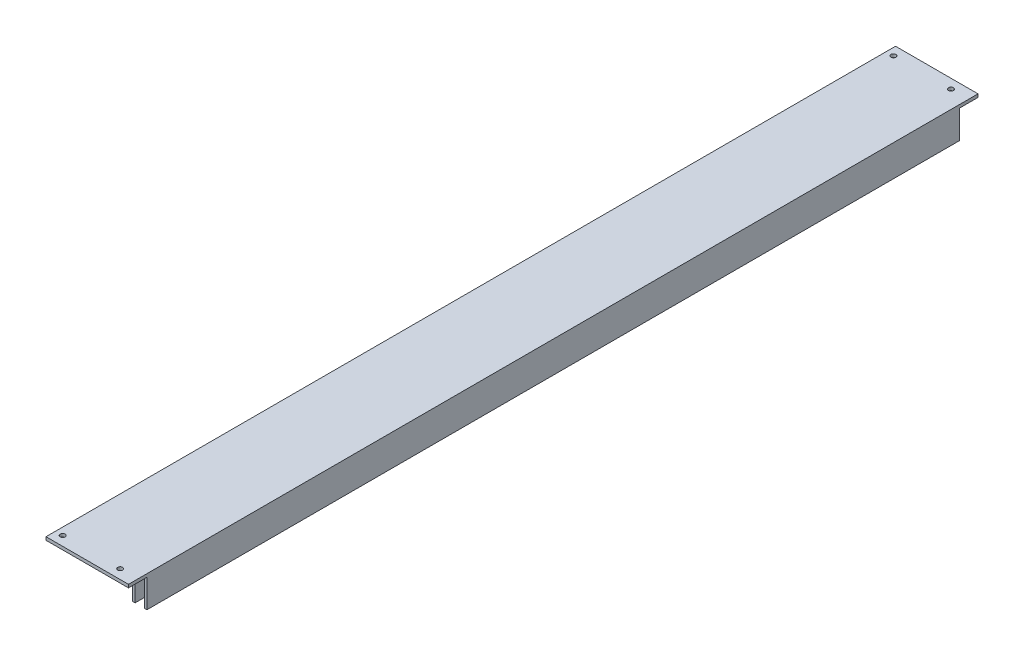
ISO-10303-21;
HEADER;
FILE_DESCRIPTION(('STEP AP214'),'2;1');
FILE_NAME('part.step','',(''),(''),'','','');
FILE_SCHEMA(('AUTOMOTIVE_DESIGN { 1 0 10303 214 1 1 1 1 }'));
ENDSEC;
DATA;
#1=APPLICATION_CONTEXT('core data for automotive mechanical design processes');
#2=APPLICATION_PROTOCOL_DEFINITION('international standard','automotive_design',2000,#1);
#3=PRODUCT_CONTEXT('',#1,'mechanical');
#4=PRODUCT('Part','Part','',(#3));
#5=PRODUCT_RELATED_PRODUCT_CATEGORY('part','',(#4));
#6=PRODUCT_DEFINITION_FORMATION('','',#4);
#7=PRODUCT_DEFINITION_CONTEXT('part definition',#1,'design');
#8=PRODUCT_DEFINITION('design','',#6,#7);
#9=PRODUCT_DEFINITION_SHAPE('','',#8);
#10=(LENGTH_UNIT() NAMED_UNIT(*) SI_UNIT(.MILLI.,.METRE.));
#11=(NAMED_UNIT(*) PLANE_ANGLE_UNIT() SI_UNIT($,.RADIAN.));
#12=(NAMED_UNIT(*) SI_UNIT($,.STERADIAN.) SOLID_ANGLE_UNIT());
#13=UNCERTAINTY_MEASURE_WITH_UNIT(LENGTH_MEASURE(1.E-05),#10,'distance_accuracy_value','');
#14=(GEOMETRIC_REPRESENTATION_CONTEXT(3) GLOBAL_UNCERTAINTY_ASSIGNED_CONTEXT((#13)) GLOBAL_UNIT_ASSIGNED_CONTEXT((#10,
#11,#12)) REPRESENTATION_CONTEXT('',''));
#15=CARTESIAN_POINT('',(0.,0.,0.));
#16=DIRECTION('',(0.,0.,1.));
#17=DIRECTION('',(1.,0.,0.));
#18=AXIS2_PLACEMENT_3D('',#15,#16,#17);
#19=CARTESIAN_POINT('',(-14.9787289884313,281.999999999999,-246.3325));
#20=DIRECTION('',(0.,0.,1.));
#21=DIRECTION('',(1.,0.,0.));
#22=AXIS2_PLACEMENT_3D('',#19,#20,#21);
#23=PLANE('',#22);
#24=DIRECTION('',(1.,0.,0.));
#25=VECTOR('',#24,1.);
#26=CARTESIAN_POINT('',(-22.1787289884313,264.930896236257,-246.3325));
#27=LINE('',#26,#25);
#28=CARTESIAN_POINT('',(-23.6787289884313,264.930896236257,-246.3325));
#29=VERTEX_POINT('',#28);
#30=CARTESIAN_POINT('',(-22.1787289884313,264.930896236257,-246.3325));
#31=VERTEX_POINT('',#30);
#32=EDGE_CURVE('E109',#29,#31,#27,.T.);
#33=ORIENTED_EDGE('',*,*,#32,.F.);
#34=DIRECTION('',(0.,1.,0.));
#35=VECTOR('',#34,1.);
#36=CARTESIAN_POINT('',(-23.6787289884313,264.930896236257,-246.3325));
#37=LINE('',#36,#35);
#38=CARTESIAN_POINT('',(-23.6787289884313,281.999999999999,-246.3325));
#39=VERTEX_POINT('',#38);
#40=EDGE_CURVE('E111',#39,#29,#37,.F.);
#41=ORIENTED_EDGE('',*,*,#40,.F.);
#42=DIRECTION('',(1.,0.,0.));
#43=VECTOR('',#42,1.);
#44=CARTESIAN_POINT('',(-14.9787289884313,281.999999999999,-246.3325));
#45=LINE('',#44,#43);
#46=CARTESIAN_POINT('',(-22.1787289884313,281.999999999999,-246.3325));
#47=VERTEX_POINT('',#46);
#48=EDGE_CURVE('E133',#47,#39,#45,.F.);
#49=ORIENTED_EDGE('',*,*,#48,.F.);
#50=DIRECTION('',(0.,1.,0.));
#51=VECTOR('',#50,1.);
#52=CARTESIAN_POINT('',(-22.1787289884313,282.,-246.3325));
#53=LINE('',#52,#51);
#54=EDGE_CURVE('E114',#31,#47,#53,.T.);
#55=ORIENTED_EDGE('',*,*,#54,.F.);
#56=EDGE_LOOP('',(#33,#41,#49,#55));
#57=FACE_BOUND('',#56,.T.);
#58=ADVANCED_FACE('F16',(#57),#23,.F.);
#59=CARTESIAN_POINT('',(-14.9787289884313,264.930896236257,246.3325));
#60=DIRECTION('',(0.,0.,-1.));
#61=DIRECTION('',(-1.,0.,0.));
#62=AXIS2_PLACEMENT_3D('',#59,#60,#61);
#63=PLANE('',#62);
#64=DIRECTION('',(1.,0.,0.));
#65=VECTOR('',#64,1.);
#66=CARTESIAN_POINT('',(-22.1787289884313,264.930896236257,246.3325));
#67=LINE('',#66,#65);
#68=CARTESIAN_POINT('',(-22.1787289884313,264.930896236257,246.3325));
#69=VERTEX_POINT('',#68);
#70=CARTESIAN_POINT('',(-23.6787289884313,264.930896236257,246.3325));
#71=VERTEX_POINT('',#70);
#72=EDGE_CURVE('E103',#69,#71,#67,.F.);
#73=ORIENTED_EDGE('',*,*,#72,.F.);
#74=DIRECTION('',(0.,1.,0.));
#75=VECTOR('',#74,1.);
#76=CARTESIAN_POINT('',(-22.1787289884313,282.,246.3325));
#77=LINE('',#76,#75);
#78=CARTESIAN_POINT('',(-22.1787289884313,281.999999999999,246.3325));
#79=VERTEX_POINT('',#78);
#80=EDGE_CURVE('E220',#79,#69,#77,.F.);
#81=ORIENTED_EDGE('',*,*,#80,.F.);
#82=DIRECTION('',(-1.,0.,0.));
#83=VECTOR('',#82,1.);
#84=CARTESIAN_POINT('',(-14.9787289884313,282.,246.3325));
#85=LINE('',#84,#83);
#86=CARTESIAN_POINT('',(-23.6787289884313,282.,246.3325));
#87=VERTEX_POINT('',#86);
#88=EDGE_CURVE('E116',#87,#79,#85,.F.);
#89=ORIENTED_EDGE('',*,*,#88,.F.);
#90=DIRECTION('',(0.,1.,0.));
#91=VECTOR('',#90,1.);
#92=CARTESIAN_POINT('',(-23.6787289884313,264.930896236257,246.3325));
#93=LINE('',#92,#91);
#94=EDGE_CURVE('E123',#71,#87,#93,.T.);
#95=ORIENTED_EDGE('',*,*,#94,.F.);
#96=EDGE_LOOP('',(#73,#81,#89,#95));
#97=FACE_BOUND('',#96,.T.);
#98=ADVANCED_FACE('F231',(#97),#63,.F.);
#99=CARTESIAN_POINT('',(-22.1787289884313,264.930896236257,0.));
#100=DIRECTION('',(0.,-1.,0.));
#101=DIRECTION('',(0.,0.,-1.));
#102=AXIS2_PLACEMENT_3D('',#99,#100,#101);
#103=PLANE('',#102);
#104=ORIENTED_EDGE('',*,*,#72,.T.);
#105=DIRECTION('',(0.,0.,1.));
#106=VECTOR('',#105,1.);
#107=CARTESIAN_POINT('',(-23.6787289884313,264.930896236257,0.));
#108=LINE('',#107,#106);
#109=EDGE_CURVE('E119',#29,#71,#108,.T.);
#110=ORIENTED_EDGE('',*,*,#109,.F.);
#111=ORIENTED_EDGE('',*,*,#32,.T.);
#112=DIRECTION('',(0.,0.,-1.));
#113=VECTOR('',#112,1.);
#114=CARTESIAN_POINT('',(-22.1787289884313,264.930896236257,0.));
#115=LINE('',#114,#113);
#116=EDGE_CURVE('E218',#69,#31,#115,.T.);
#117=ORIENTED_EDGE('',*,*,#116,.F.);
#118=EDGE_LOOP('',(#104,#110,#111,#117));
#119=FACE_BOUND('',#118,.T.);
#120=ADVANCED_FACE('F120',(#119),#103,.T.);
#121=CARTESIAN_POINT('',(-16.4787289884313,264.930896236257,0.));
#122=DIRECTION('',(-1.,0.,0.));
#123=DIRECTION('',(0.,0.,1.));
#124=AXIS2_PLACEMENT_3D('',#121,#122,#123);
#125=PLANE('',#124);
#126=DIRECTION('',(0.,1.,0.));
#127=VECTOR('',#126,1.);
#128=CARTESIAN_POINT('',(-16.4787289884313,264.930896236257,246.3325));
#129=LINE('',#128,#127);
#130=CARTESIAN_POINT('',(-16.4787289884313,264.930896236257,246.3325));
#131=VERTEX_POINT('',#130);
#132=CARTESIAN_POINT('',(-16.4787289884313,282.,246.3325));
#133=VERTEX_POINT('',#132);
#134=EDGE_CURVE('E214',#131,#133,#129,.T.);
#135=ORIENTED_EDGE('',*,*,#134,.T.);
#136=DIRECTION('',(0.,0.,-1.));
#137=VECTOR('',#136,1.);
#138=CARTESIAN_POINT('',(-16.4787289884313,282.,0.));
#139=LINE('',#138,#137);
#140=CARTESIAN_POINT('',(-16.4787289884313,281.999999999999,-246.3325));
#141=VERTEX_POINT('',#140);
#142=EDGE_CURVE('E199',#141,#133,#139,.F.);
#143=ORIENTED_EDGE('',*,*,#142,.F.);
#144=DIRECTION('',(0.,1.,0.));
#145=VECTOR('',#144,1.);
#146=CARTESIAN_POINT('',(-16.4787289884313,281.999999999999,-246.3325));
#147=LINE('',#146,#145);
#148=CARTESIAN_POINT('',(-16.4787289884313,264.930896236257,-246.3325));
#149=VERTEX_POINT('',#148);
#150=EDGE_CURVE('E216',#141,#149,#147,.F.);
#151=ORIENTED_EDGE('',*,*,#150,.T.);
#152=DIRECTION('',(0.,0.,-1.));
#153=VECTOR('',#152,1.);
#154=CARTESIAN_POINT('',(-16.4787289884313,264.930896236257,0.));
#155=LINE('',#154,#153);
#156=EDGE_CURVE('E205',#131,#149,#155,.T.);
#157=ORIENTED_EDGE('',*,*,#156,.F.);
#158=EDGE_LOOP('',(#135,#143,#151,#157));
#159=FACE_BOUND('',#158,.T.);
#160=ADVANCED_FACE('F239',(#159),#125,.T.);
#161=CARTESIAN_POINT('',(-23.6787289884313,264.930896236257,0.));
#162=DIRECTION('',(-1.,0.,0.));
#163=DIRECTION('',(0.,0.,1.));
#164=AXIS2_PLACEMENT_3D('',#161,#162,#163);
#165=PLANE('',#164);
#166=ORIENTED_EDGE('',*,*,#94,.T.);
#167=DIRECTION('',(0.,0.,-1.));
#168=VECTOR('',#167,1.);
#169=CARTESIAN_POINT('',(-23.6787289884313,282.,0.));
#170=LINE('',#169,#168);
#171=EDGE_CURVE('E127',#39,#87,#170,.F.);
#172=ORIENTED_EDGE('',*,*,#171,.F.);
#173=ORIENTED_EDGE('',*,*,#40,.T.);
#174=ORIENTED_EDGE('',*,*,#109,.T.);
#175=EDGE_LOOP('',(#166,#172,#173,#174));
#176=FACE_BOUND('',#175,.T.);
#177=ADVANCED_FACE('F125',(#176),#165,.T.);
#178=CARTESIAN_POINT('',(-22.1787289884313,282.,0.));
#179=DIRECTION('',(1.,0.,0.));
#180=DIRECTION('',(0.,0.,-1.));
#181=AXIS2_PLACEMENT_3D('',#178,#179,#180);
#182=PLANE('',#181);
#183=ORIENTED_EDGE('',*,*,#80,.T.);
#184=ORIENTED_EDGE('',*,*,#116,.T.);
#185=ORIENTED_EDGE('',*,*,#54,.T.);
#186=DIRECTION('',(0.,0.,-1.));
#187=VECTOR('',#186,1.);
#188=CARTESIAN_POINT('',(-22.1787289884313,282.,0.));
#189=LINE('',#188,#187);
#190=EDGE_CURVE('E193',#79,#47,#189,.T.);
#191=ORIENTED_EDGE('',*,*,#190,.F.);
#192=EDGE_LOOP('',(#183,#184,#185,#191));
#193=FACE_BOUND('',#192,.T.);
#194=ADVANCED_FACE('F230',(#193),#182,.T.);
#195=CARTESIAN_POINT('',(-14.9787289884313,281.999999999999,-246.3325));
#196=DIRECTION('',(0.,0.,1.));
#197=DIRECTION('',(1.,0.,0.));
#198=AXIS2_PLACEMENT_3D('',#195,#196,#197);
#199=PLANE('',#198);
#200=DIRECTION('',(1.,0.,0.));
#201=VECTOR('',#200,1.);
#202=CARTESIAN_POINT('',(-23.6787289884313,282.,-246.3325));
#203=LINE('',#202,#201);
#204=CARTESIAN_POINT('',(-14.9787289884313,281.999999999999,-246.3325));
#205=VERTEX_POINT('',#204);
#206=EDGE_CURVE('E202',#205,#141,#203,.F.);
#207=ORIENTED_EDGE('',*,*,#206,.F.);
#208=DIRECTION('',(0.,1.,0.));
#209=VECTOR('',#208,1.);
#210=CARTESIAN_POINT('',(-14.9787289884313,283.9,-246.3325));
#211=LINE('',#210,#209);
#212=CARTESIAN_POINT('',(-14.9787289884313,264.930896236257,-246.3325));
#213=VERTEX_POINT('',#212);
#214=EDGE_CURVE('E188',#213,#205,#211,.T.);
#215=ORIENTED_EDGE('',*,*,#214,.F.);
#216=DIRECTION('',(1.,0.,0.));
#217=VECTOR('',#216,1.);
#218=CARTESIAN_POINT('',(-14.9787289884313,264.930896236257,-246.3325));
#219=LINE('',#218,#217);
#220=EDGE_CURVE('E211',#149,#213,#219,.T.);
#221=ORIENTED_EDGE('',*,*,#220,.F.);
#222=ORIENTED_EDGE('',*,*,#150,.F.);
#223=EDGE_LOOP('',(#207,#215,#221,#222));
#224=FACE_BOUND('',#223,.T.);
#225=ADVANCED_FACE('F277',(#224),#199,.F.);
#226=CARTESIAN_POINT('',(-14.9787289884313,264.930896236257,246.3325));
#227=DIRECTION('',(0.,0.,-1.));
#228=DIRECTION('',(-1.,0.,0.));
#229=AXIS2_PLACEMENT_3D('',#226,#227,#228);
#230=PLANE('',#229);
#231=DIRECTION('',(1.,0.,0.));
#232=VECTOR('',#231,1.);
#233=CARTESIAN_POINT('',(-14.9787289884313,264.930896236257,246.3325));
#234=LINE('',#233,#232);
#235=CARTESIAN_POINT('',(-14.9787289884313,264.930896236257,246.3325));
#236=VERTEX_POINT('',#235);
#237=EDGE_CURVE('E208',#236,#131,#234,.F.);
#238=ORIENTED_EDGE('',*,*,#237,.F.);
#239=DIRECTION('',(0.,1.,0.));
#240=VECTOR('',#239,1.);
#241=CARTESIAN_POINT('',(-14.9787289884313,283.9,246.3325));
#242=LINE('',#241,#240);
#243=CARTESIAN_POINT('',(-14.9787289884313,282.,246.3325));
#244=VERTEX_POINT('',#243);
#245=EDGE_CURVE('E177',#244,#236,#242,.F.);
#246=ORIENTED_EDGE('',*,*,#245,.F.);
#247=DIRECTION('',(1.,0.,0.));
#248=VECTOR('',#247,1.);
#249=CARTESIAN_POINT('',(-23.6787289884313,282.,246.3325));
#250=LINE('',#249,#248);
#251=EDGE_CURVE('E197',#133,#244,#250,.T.);
#252=ORIENTED_EDGE('',*,*,#251,.F.);
#253=ORIENTED_EDGE('',*,*,#134,.F.);
#254=EDGE_LOOP('',(#238,#246,#252,#253));
#255=FACE_BOUND('',#254,.T.);
#256=ADVANCED_FACE('F273',(#255),#230,.F.);
#257=CARTESIAN_POINT('',(-14.9787289884313,264.930896236257,0.));
#258=DIRECTION('',(0.,-1.,0.));
#259=DIRECTION('',(0.,0.,-1.));
#260=AXIS2_PLACEMENT_3D('',#257,#258,#259);
#261=PLANE('',#260);
#262=ORIENTED_EDGE('',*,*,#237,.T.);
#263=ORIENTED_EDGE('',*,*,#156,.T.);
#264=ORIENTED_EDGE('',*,*,#220,.T.);
#265=DIRECTION('',(0.,0.,-1.));
#266=VECTOR('',#265,1.);
#267=CARTESIAN_POINT('',(-14.9787289884313,264.930896236257,0.));
#268=LINE('',#267,#266);
#269=EDGE_CURVE('E174',#236,#213,#268,.T.);
#270=ORIENTED_EDGE('',*,*,#269,.F.);
#271=EDGE_LOOP('',(#262,#263,#264,#270));
#272=FACE_BOUND('',#271,.T.);
#273=ADVANCED_FACE('F270',(#272),#261,.T.);
#274=CARTESIAN_POINT('',(-23.6787289884313,282.,0.));
#275=DIRECTION('',(0.,-1.,0.));
#276=DIRECTION('',(0.,0.,-1.));
#277=AXIS2_PLACEMENT_3D('',#274,#275,#276);
#278=PLANE('',#277);
#279=CARTESIAN_POINT('',(-60.5787289884313,282.,251.8545));
#280=DIRECTION('',(0.,-1.,0.));
#281=DIRECTION('',(0.,0.,-1.));
#282=AXIS2_PLACEMENT_3D('',#279,#280,#281);
#283=CIRCLE('',#282,1.50000000000001);
#284=CARTESIAN_POINT('',(-60.5787289884313,282.,250.3545));
#285=VERTEX_POINT('',#284);
#286=EDGE_CURVE('E20',#285,#285,#283,.F.);
#287=ORIENTED_EDGE('',*,*,#286,.T.);
#288=EDGE_LOOP('',(#287));
#289=FACE_BOUND('',#288,.T.);
#290=CARTESIAN_POINT('',(-25.6787289884313,282.,251.8545));
#291=DIRECTION('',(0.,-1.,0.));
#292=DIRECTION('',(0.,0.,-1.));
#293=AXIS2_PLACEMENT_3D('',#290,#291,#292);
#294=CIRCLE('',#293,1.50000000000001);
#295=CARTESIAN_POINT('',(-25.6787289884313,282.,250.3545));
#296=VERTEX_POINT('',#295);
#297=EDGE_CURVE('E150',#296,#296,#294,.F.);
#298=ORIENTED_EDGE('',*,*,#297,.T.);
#299=EDGE_LOOP('',(#298));
#300=FACE_BOUND('',#299,.T.);
#301=CARTESIAN_POINT('',(-60.5787289884314,282.,-251.8545));
#302=DIRECTION('',(0.,-1.,0.));
#303=DIRECTION('',(0.,0.,-1.));
#304=AXIS2_PLACEMENT_3D('',#301,#302,#303);
#305=CIRCLE('',#304,1.49999999999993);
#306=CARTESIAN_POINT('',(-60.5787289884314,282.,-253.3545));
#307=VERTEX_POINT('',#306);
#308=EDGE_CURVE('E148',#307,#307,#305,.F.);
#309=ORIENTED_EDGE('',*,*,#308,.T.);
#310=EDGE_LOOP('',(#309));
#311=FACE_BOUND('',#310,.T.);
#312=CARTESIAN_POINT('',(-25.6787289884314,282.,-251.8545));
#313=DIRECTION('',(0.,-1.,0.));
#314=DIRECTION('',(0.,0.,-1.));
#315=AXIS2_PLACEMENT_3D('',#312,#313,#314);
#316=CIRCLE('',#315,1.49999999999993);
#317=CARTESIAN_POINT('',(-25.6787289884314,282.,-253.3545));
#318=VERTEX_POINT('',#317);
#319=EDGE_CURVE('E144',#318,#318,#316,.F.);
#320=ORIENTED_EDGE('',*,*,#319,.T.);
#321=EDGE_LOOP('',(#320));
#322=FACE_BOUND('',#321,.T.);
#323=ORIENTED_EDGE('',*,*,#190,.T.);
#324=ORIENTED_EDGE('',*,*,#48,.T.);
#325=ORIENTED_EDGE('',*,*,#171,.T.);
#326=ORIENTED_EDGE('',*,*,#88,.T.);
#327=EDGE_LOOP('',(#323,#324,#325,#326));
#328=FACE_BOUND('',#327,.T.);
#329=DIRECTION('',(1.,0.,0.));
#330=VECTOR('',#329,1.);
#331=CARTESIAN_POINT('',(-31.7852297780093,282.,257.5325));
#332=LINE('',#331,#330);
#333=CARTESIAN_POINT('',(-64.9787289884313,282.,257.5325));
#334=VERTEX_POINT('',#333);
#335=CARTESIAN_POINT('',(-14.9787289884313,282.,257.5325));
#336=VERTEX_POINT('',#335);
#337=EDGE_CURVE('E191',#334,#336,#332,.T.);
#338=ORIENTED_EDGE('',*,*,#337,.F.);
#339=DIRECTION('',(0.,0.,1.));
#340=VECTOR('',#339,1.);
#341=CARTESIAN_POINT('',(-64.9787289884313,282.,0.));
#342=LINE('',#341,#340);
#343=CARTESIAN_POINT('',(-64.9787289884313,282.,-257.5325));
#344=VERTEX_POINT('',#343);
#345=EDGE_CURVE('E155',#344,#334,#342,.T.);
#346=ORIENTED_EDGE('',*,*,#345,.F.);
#347=DIRECTION('',(1.,0.,0.));
#348=VECTOR('',#347,1.);
#349=CARTESIAN_POINT('',(-31.7852297780093,282.,-257.5325));
#350=LINE('',#349,#348);
#351=CARTESIAN_POINT('',(-14.9787289884313,281.999999999999,-257.5325));
#352=VERTEX_POINT('',#351);
#353=EDGE_CURVE('E169',#344,#352,#350,.T.);
#354=ORIENTED_EDGE('',*,*,#353,.T.);
#355=DIRECTION('',(0.,0.,-1.));
#356=VECTOR('',#355,1.);
#357=CARTESIAN_POINT('',(-14.9787289884313,281.999999999999,0.));
#358=LINE('',#357,#356);
#359=EDGE_CURVE('E186',#205,#352,#358,.T.);
#360=ORIENTED_EDGE('',*,*,#359,.F.);
#361=ORIENTED_EDGE('',*,*,#206,.T.);
#362=ORIENTED_EDGE('',*,*,#142,.T.);
#363=ORIENTED_EDGE('',*,*,#251,.T.);
#364=DIRECTION('',(0.,0.,-1.));
#365=VECTOR('',#364,1.);
#366=CARTESIAN_POINT('',(-14.9787289884313,282.,0.));
#367=LINE('',#366,#365);
#368=EDGE_CURVE('E180',#336,#244,#367,.T.);
#369=ORIENTED_EDGE('',*,*,#368,.F.);
#370=EDGE_LOOP('',(#338,#346,#354,#360,#361,#362,#363,#369));
#371=FACE_BOUND('',#370,.T.);
#372=ADVANCED_FACE('F225',(#289,#300,#311,#322,#328,#371),#278,.T.);
#373=CARTESIAN_POINT('',(-31.7852297780093,278.889138364981,257.5325));
#374=DIRECTION('',(0.,0.,1.));
#375=DIRECTION('',(1.,0.,0.));
#376=AXIS2_PLACEMENT_3D('',#373,#374,#375);
#377=PLANE('',#376);
#378=DIRECTION('',(1.,0.,0.));
#379=VECTOR('',#378,1.);
#380=CARTESIAN_POINT('',(-64.9787289884313,283.9,257.5325));
#381=LINE('',#380,#379);
#382=CARTESIAN_POINT('',(-64.9787289884313,283.9,257.5325));
#383=VERTEX_POINT('',#382);
#384=CARTESIAN_POINT('',(-14.9787289884313,283.9,257.5325));
#385=VERTEX_POINT('',#384);
#386=EDGE_CURVE('E147',#383,#385,#381,.T.);
#387=ORIENTED_EDGE('',*,*,#386,.F.);
#388=DIRECTION('',(0.,1.,0.));
#389=VECTOR('',#388,1.);
#390=CARTESIAN_POINT('',(-64.9787289884313,282.,257.5325));
#391=LINE('',#390,#389);
#392=EDGE_CURVE('E163',#334,#383,#391,.T.);
#393=ORIENTED_EDGE('',*,*,#392,.F.);
#394=ORIENTED_EDGE('',*,*,#337,.T.);
#395=DIRECTION('',(0.,1.,0.));
#396=VECTOR('',#395,1.);
#397=CARTESIAN_POINT('',(-14.9787289884313,283.9,257.5325));
#398=LINE('',#397,#396);
#399=EDGE_CURVE('E183',#385,#336,#398,.F.);
#400=ORIENTED_EDGE('',*,*,#399,.F.);
#401=EDGE_LOOP('',(#387,#393,#394,#400));
#402=FACE_BOUND('',#401,.T.);
#403=ADVANCED_FACE('F263',(#402),#377,.T.);
#404=CARTESIAN_POINT('',(-14.9787289884313,283.9,0.));
#405=DIRECTION('',(1.,0.,0.));
#406=DIRECTION('',(0.,0.,-1.));
#407=AXIS2_PLACEMENT_3D('',#404,#405,#406);
#408=PLANE('',#407);
#409=ORIENTED_EDGE('',*,*,#245,.T.);
#410=ORIENTED_EDGE('',*,*,#269,.T.);
#411=ORIENTED_EDGE('',*,*,#214,.T.);
#412=ORIENTED_EDGE('',*,*,#359,.T.);
#413=DIRECTION('',(0.,1.,0.));
#414=VECTOR('',#413,1.);
#415=CARTESIAN_POINT('',(-14.9787289884313,278.889138364981,-257.5325));
#416=LINE('',#415,#414);
#417=CARTESIAN_POINT('',(-14.9787289884313,283.9,-257.5325));
#418=VERTEX_POINT('',#417);
#419=EDGE_CURVE('E172',#352,#418,#416,.T.);
#420=ORIENTED_EDGE('',*,*,#419,.T.);
#421=DIRECTION('',(0.,0.,1.));
#422=VECTOR('',#421,1.);
#423=CARTESIAN_POINT('',(-14.9787289884313,283.9,0.));
#424=LINE('',#423,#422);
#425=EDGE_CURVE('E307',#385,#418,#424,.F.);
#426=ORIENTED_EDGE('',*,*,#425,.F.);
#427=ORIENTED_EDGE('',*,*,#399,.T.);
#428=ORIENTED_EDGE('',*,*,#368,.T.);
#429=EDGE_LOOP('',(#409,#410,#411,#412,#420,#426,#427,#428));
#430=FACE_BOUND('',#429,.T.);
#431=ADVANCED_FACE('F260',(#430),#408,.T.);
#432=CARTESIAN_POINT('',(-31.7852297780093,278.889138364981,-257.5325));
#433=DIRECTION('',(0.,0.,1.));
#434=DIRECTION('',(1.,0.,0.));
#435=AXIS2_PLACEMENT_3D('',#432,#433,#434);
#436=PLANE('',#435);
#437=DIRECTION('',(0.,1.,0.));
#438=VECTOR('',#437,1.);
#439=CARTESIAN_POINT('',(-64.9787289884313,282.,-257.5325));
#440=LINE('',#439,#438);
#441=CARTESIAN_POINT('',(-64.9787289884313,283.9,-257.5325));
#442=VERTEX_POINT('',#441);
#443=EDGE_CURVE('E35',#442,#344,#440,.F.);
#444=ORIENTED_EDGE('',*,*,#443,.F.);
#445=DIRECTION('',(1.,0.,0.));
#446=VECTOR('',#445,1.);
#447=CARTESIAN_POINT('',(-64.9787289884313,283.9,-257.5325));
#448=LINE('',#447,#446);
#449=EDGE_CURVE('E305',#418,#442,#448,.F.);
#450=ORIENTED_EDGE('',*,*,#449,.F.);
#451=ORIENTED_EDGE('',*,*,#419,.F.);
#452=ORIENTED_EDGE('',*,*,#353,.F.);
#453=EDGE_LOOP('',(#444,#450,#451,#452));
#454=FACE_BOUND('',#453,.T.);
#455=ADVANCED_FACE('F257',(#454),#436,.F.);
#456=CARTESIAN_POINT('',(-64.9787289884313,282.,0.));
#457=DIRECTION('',(-1.,0.,0.));
#458=DIRECTION('',(0.,0.,1.));
#459=AXIS2_PLACEMENT_3D('',#456,#457,#458);
#460=PLANE('',#459);
#461=ORIENTED_EDGE('',*,*,#443,.T.);
#462=ORIENTED_EDGE('',*,*,#345,.T.);
#463=ORIENTED_EDGE('',*,*,#392,.T.);
#464=DIRECTION('',(0.,0.,1.));
#465=VECTOR('',#464,1.);
#466=CARTESIAN_POINT('',(-64.9787289884313,283.9,0.));
#467=LINE('',#466,#465);
#468=EDGE_CURVE('E143',#442,#383,#467,.T.);
#469=ORIENTED_EDGE('',*,*,#468,.F.);
#470=EDGE_LOOP('',(#461,#462,#463,#469));
#471=FACE_BOUND('',#470,.T.);
#472=ADVANCED_FACE('F253',(#471),#460,.T.);
#473=CARTESIAN_POINT('',(-60.5787289884313,283.9,251.8545));
#474=DIRECTION('',(0.,-1.,0.));
#475=DIRECTION('',(0.,0.,-1.));
#476=AXIS2_PLACEMENT_3D('',#473,#474,#475);
#477=CYLINDRICAL_SURFACE('',#476,1.50000000000001);
#478=CARTESIAN_POINT('',(-60.5787289884313,283.9,251.8545));
#479=DIRECTION('',(0.,-1.,0.));
#480=DIRECTION('',(0.,0.,-1.));
#481=AXIS2_PLACEMENT_3D('',#478,#479,#480);
#482=CIRCLE('',#481,1.50000000000001);
#483=CARTESIAN_POINT('',(-60.5787289884313,283.9,250.3545));
#484=VERTEX_POINT('',#483);
#485=EDGE_CURVE('E140',#484,#484,#482,.T.);
#486=ORIENTED_EDGE('',*,*,#485,.F.);
#487=EDGE_LOOP('',(#486));
#488=FACE_BOUND('',#487,.T.);
#489=ORIENTED_EDGE('',*,*,#286,.F.);
#490=EDGE_LOOP('',(#489));
#491=FACE_BOUND('',#490,.T.);
#492=ADVANCED_FACE('F256',(#488,#491),#477,.F.);
#493=CARTESIAN_POINT('',(-25.6787289884313,283.9,251.8545));
#494=DIRECTION('',(0.,-1.,0.));
#495=DIRECTION('',(0.,0.,-1.));
#496=AXIS2_PLACEMENT_3D('',#493,#494,#495);
#497=CYLINDRICAL_SURFACE('',#496,1.50000000000001);
#498=CARTESIAN_POINT('',(-25.6787289884313,283.9,251.8545));
#499=DIRECTION('',(0.,-1.,0.));
#500=DIRECTION('',(0.,0.,-1.));
#501=AXIS2_PLACEMENT_3D('',#498,#499,#500);
#502=CIRCLE('',#501,1.50000000000001);
#503=CARTESIAN_POINT('',(-25.6787289884313,283.9,250.3545));
#504=VERTEX_POINT('',#503);
#505=EDGE_CURVE('E137',#504,#504,#502,.T.);
#506=ORIENTED_EDGE('',*,*,#505,.F.);
#507=EDGE_LOOP('',(#506));
#508=FACE_BOUND('',#507,.T.);
#509=ORIENTED_EDGE('',*,*,#297,.F.);
#510=EDGE_LOOP('',(#509));
#511=FACE_BOUND('',#510,.T.);
#512=ADVANCED_FACE('F361',(#508,#511),#497,.F.);
#513=CARTESIAN_POINT('',(-60.5787289884314,283.9,-251.8545));
#514=DIRECTION('',(0.,-1.,0.));
#515=DIRECTION('',(0.,0.,-1.));
#516=AXIS2_PLACEMENT_3D('',#513,#514,#515);
#517=CYLINDRICAL_SURFACE('',#516,1.49999999999993);
#518=CARTESIAN_POINT('',(-60.5787289884314,283.9,-251.8545));
#519=DIRECTION('',(0.,-1.,0.));
#520=DIRECTION('',(0.,0.,-1.));
#521=AXIS2_PLACEMENT_3D('',#518,#519,#520);
#522=CIRCLE('',#521,1.49999999999993);
#523=CARTESIAN_POINT('',(-60.5787289884314,283.9,-253.3545));
#524=VERTEX_POINT('',#523);
#525=EDGE_CURVE('E26',#524,#524,#522,.T.);
#526=ORIENTED_EDGE('',*,*,#525,.F.);
#527=EDGE_LOOP('',(#526));
#528=FACE_BOUND('',#527,.T.);
#529=ORIENTED_EDGE('',*,*,#308,.F.);
#530=EDGE_LOOP('',(#529));
#531=FACE_BOUND('',#530,.T.);
#532=ADVANCED_FACE('F249',(#528,#531),#517,.F.);
#533=CARTESIAN_POINT('',(-25.6787289884314,283.9,-251.8545));
#534=DIRECTION('',(0.,-1.,0.));
#535=DIRECTION('',(0.,0.,-1.));
#536=AXIS2_PLACEMENT_3D('',#533,#534,#535);
#537=CYLINDRICAL_SURFACE('',#536,1.49999999999993);
#538=CARTESIAN_POINT('',(-25.6787289884314,283.9,-251.8545));
#539=DIRECTION('',(0.,-1.,0.));
#540=DIRECTION('',(0.,0.,-1.));
#541=AXIS2_PLACEMENT_3D('',#538,#539,#540);
#542=CIRCLE('',#541,1.49999999999993);
#543=CARTESIAN_POINT('',(-25.6787289884314,283.9,-253.3545));
#544=VERTEX_POINT('',#543);
#545=EDGE_CURVE('E10',#544,#544,#542,.T.);
#546=ORIENTED_EDGE('',*,*,#545,.F.);
#547=EDGE_LOOP('',(#546));
#548=FACE_BOUND('',#547,.T.);
#549=ORIENTED_EDGE('',*,*,#319,.F.);
#550=EDGE_LOOP('',(#549));
#551=FACE_BOUND('',#550,.T.);
#552=ADVANCED_FACE('F18',(#548,#551),#537,.F.);
#553=CARTESIAN_POINT('',(-64.9787289884313,283.9,0.));
#554=DIRECTION('',(0.,1.,0.));
#555=DIRECTION('',(0.,0.,1.));
#556=AXIS2_PLACEMENT_3D('',#553,#554,#555);
#557=PLANE('',#556);
#558=ORIENTED_EDGE('',*,*,#545,.T.);
#559=EDGE_LOOP('',(#558));
#560=FACE_BOUND('',#559,.T.);
#561=ORIENTED_EDGE('',*,*,#525,.T.);
#562=EDGE_LOOP('',(#561));
#563=FACE_BOUND('',#562,.T.);
#564=ORIENTED_EDGE('',*,*,#505,.T.);
#565=EDGE_LOOP('',(#564));
#566=FACE_BOUND('',#565,.T.);
#567=ORIENTED_EDGE('',*,*,#485,.T.);
#568=EDGE_LOOP('',(#567));
#569=FACE_BOUND('',#568,.T.);
#570=ORIENTED_EDGE('',*,*,#449,.T.);
#571=ORIENTED_EDGE('',*,*,#468,.T.);
#572=ORIENTED_EDGE('',*,*,#386,.T.);
#573=ORIENTED_EDGE('',*,*,#425,.T.);
#574=EDGE_LOOP('',(#570,#571,#572,#573));
#575=FACE_BOUND('',#574,.T.);
#576=ADVANCED_FACE('F242',(#560,#563,#566,#569,#575),#557,.T.);
#577=CLOSED_SHELL('',(#58,#98,#120,#160,#177,#194,#225,#256,#273,#372,#403,#431,#455,#472,#492,
#512,#532,#552,#576));
#578=MANIFOLD_SOLID_BREP('B1',#577);
#579=ADVANCED_BREP_SHAPE_REPRESENTATION('',(#18,#578),#14);
#580=SHAPE_DEFINITION_REPRESENTATION(#9,#579);
ENDSEC;
END-ISO-10303-21;
